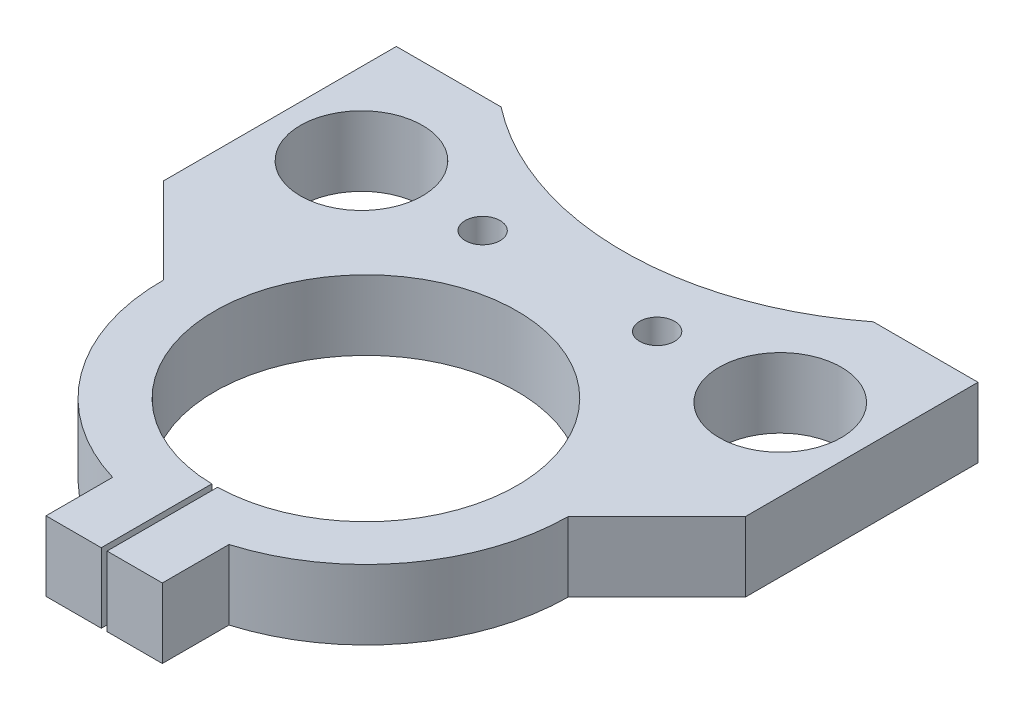
ISO-10303-21;
HEADER;
FILE_DESCRIPTION(('STEP AP214'),'2;1');
FILE_NAME('part.step','',(''),(''),'','','');
FILE_SCHEMA(('AUTOMOTIVE_DESIGN { 1 0 10303 214 1 1 1 1 }'));
ENDSEC;
DATA;
#1=APPLICATION_CONTEXT('core data for automotive mechanical design processes');
#2=APPLICATION_PROTOCOL_DEFINITION('international standard','automotive_design',2000,#1);
#3=PRODUCT_CONTEXT('',#1,'mechanical');
#4=PRODUCT('Part','Part','',(#3));
#5=PRODUCT_RELATED_PRODUCT_CATEGORY('part','',(#4));
#6=PRODUCT_DEFINITION_FORMATION('','',#4);
#7=PRODUCT_DEFINITION_CONTEXT('part definition',#1,'design');
#8=PRODUCT_DEFINITION('design','',#6,#7);
#9=PRODUCT_DEFINITION_SHAPE('','',#8);
#10=(LENGTH_UNIT() NAMED_UNIT(*) SI_UNIT(.MILLI.,.METRE.));
#11=(NAMED_UNIT(*) PLANE_ANGLE_UNIT() SI_UNIT($,.RADIAN.));
#12=(NAMED_UNIT(*) SI_UNIT($,.STERADIAN.) SOLID_ANGLE_UNIT());
#13=UNCERTAINTY_MEASURE_WITH_UNIT(LENGTH_MEASURE(1.E-05),#10,'distance_accuracy_value','');
#14=(GEOMETRIC_REPRESENTATION_CONTEXT(3) GLOBAL_UNCERTAINTY_ASSIGNED_CONTEXT((#13)) GLOBAL_UNIT_ASSIGNED_CONTEXT((#10,
#11,#12)) REPRESENTATION_CONTEXT('',''));
#15=CARTESIAN_POINT('',(0.,0.,0.));
#16=DIRECTION('',(0.,0.,1.));
#17=DIRECTION('',(1.,0.,0.));
#18=AXIS2_PLACEMENT_3D('',#15,#16,#17);
#19=CARTESIAN_POINT('',(50.,0.,100.));
#20=DIRECTION('',(0.,0.,1.));
#21=DIRECTION('',(1.,0.,0.));
#22=AXIS2_PLACEMENT_3D('',#19,#20,#21);
#23=PLANE('',#22);
#24=DIRECTION('',(0.,1.,0.));
#25=VECTOR('',#24,1.);
#26=CARTESIAN_POINT('',(0.265039177937347,-0.000999999999999265,100.));
#27=LINE('',#26,#25);
#28=CARTESIAN_POINT('',(0.265039177937347,0.,100.));
#29=VERTEX_POINT('',#28);
#30=CARTESIAN_POINT('',(0.265039177937347,12.,100.));
#31=VERTEX_POINT('',#30);
#32=EDGE_CURVE('E283',#29,#31,#27,.T.);
#33=ORIENTED_EDGE('',*,*,#32,.F.);
#34=DIRECTION('',(1.,0.,0.));
#35=VECTOR('',#34,1.);
#36=CARTESIAN_POINT('',(50.,0.,100.));
#37=LINE('',#36,#35);
#38=CARTESIAN_POINT('',(9.76503917793735,0.,100.));
#39=VERTEX_POINT('',#38);
#40=EDGE_CURVE('E208',#29,#39,#37,.T.);
#41=ORIENTED_EDGE('',*,*,#40,.T.);
#42=DIRECTION('',(0.,1.,0.));
#43=VECTOR('',#42,1.);
#44=CARTESIAN_POINT('',(9.76503917793735,-0.000999999999999265,100.));
#45=LINE('',#44,#43);
#46=CARTESIAN_POINT('',(9.76503917793735,12.,100.));
#47=VERTEX_POINT('',#46);
#48=EDGE_CURVE('E255',#39,#47,#45,.T.);
#49=ORIENTED_EDGE('',*,*,#48,.T.);
#50=DIRECTION('',(1.,0.,0.));
#51=VECTOR('',#50,1.);
#52=CARTESIAN_POINT('',(50.,12.,100.));
#53=LINE('',#52,#51);
#54=EDGE_CURVE('E203',#31,#47,#53,.T.);
#55=ORIENTED_EDGE('',*,*,#54,.F.);
#56=EDGE_LOOP('',(#33,#41,#49,#55));
#57=FACE_BOUND('',#56,.T.);
#58=ADVANCED_FACE('F32',(#57),#23,.T.);
#59=CARTESIAN_POINT('',(50.,12.,50.));
#60=DIRECTION('',(0.,1.,0.));
#61=DIRECTION('',(0.,0.,1.));
#62=AXIS2_PLACEMENT_3D('',#59,#60,#61);
#63=PLANE('',#62);
#64=CARTESIAN_POINT('',(14.8374657319728,12.,20.));
#65=DIRECTION('',(0.,1.,0.));
#66=DIRECTION('',(0.,0.,1.));
#67=AXIS2_PLACEMENT_3D('',#64,#65,#66);
#68=CIRCLE('',#67,3.);
#69=CARTESIAN_POINT('',(14.8374657319728,12.,23.));
#70=VERTEX_POINT('',#69);
#71=EDGE_CURVE('E392',#70,#70,#68,.T.);
#72=ORIENTED_EDGE('',*,*,#71,.F.);
#73=EDGE_LOOP('',(#72));
#74=FACE_BOUND('',#73,.T.);
#75=CARTESIAN_POINT('',(-15.1625342680272,12.,20.));
#76=DIRECTION('',(0.,1.,0.));
#77=DIRECTION('',(0.,0.,1.));
#78=AXIS2_PLACEMENT_3D('',#75,#76,#77);
#79=CIRCLE('',#78,3.);
#80=CARTESIAN_POINT('',(-15.1625342680272,12.,23.));
#81=VERTEX_POINT('',#80);
#82=EDGE_CURVE('E397',#81,#81,#79,.T.);
#83=ORIENTED_EDGE('',*,*,#82,.F.);
#84=EDGE_LOOP('',(#83));
#85=FACE_BOUND('',#84,.T.);
#86=DIRECTION('',(1.,0.,0.));
#87=VECTOR('',#86,1.);
#88=CARTESIAN_POINT('',(32.,12.,0.));
#89=LINE('',#88,#87);
#90=CARTESIAN_POINT('',(32.,12.,0.));
#91=VERTEX_POINT('',#90);
#92=CARTESIAN_POINT('',(50.,12.,0.));
#93=VERTEX_POINT('',#92);
#94=EDGE_CURVE('E178',#91,#93,#89,.T.);
#95=ORIENTED_EDGE('',*,*,#94,.F.);
#96=CARTESIAN_POINT('',(0.,12.,-41.0454545454546));
#97=DIRECTION('',(0.,1.,0.));
#98=DIRECTION('',(0.,0.,1.));
#99=AXIS2_PLACEMENT_3D('',#96,#97,#98);
#100=CIRCLE('',#99,52.0454545454546);
#101=CARTESIAN_POINT('',(-32.,12.,0.));
#102=VERTEX_POINT('',#101);
#103=EDGE_CURVE('E159',#102,#91,#100,.T.);
#104=ORIENTED_EDGE('',*,*,#103,.F.);
#105=DIRECTION('',(1.,0.,0.));
#106=VECTOR('',#105,1.);
#107=CARTESIAN_POINT('',(-50.,12.,0.));
#108=LINE('',#107,#106);
#109=CARTESIAN_POINT('',(-50.,12.,0.));
#110=VERTEX_POINT('',#109);
#111=EDGE_CURVE('E174',#110,#102,#108,.T.);
#112=ORIENTED_EDGE('',*,*,#111,.F.);
#113=DIRECTION('',(0.,0.,1.));
#114=VECTOR('',#113,1.);
#115=CARTESIAN_POINT('',(-50.,12.,-50.));
#116=LINE('',#115,#114);
#117=CARTESIAN_POINT('',(-50.,12.,40.));
#118=VERTEX_POINT('',#117);
#119=EDGE_CURVE('E11',#110,#118,#116,.T.);
#120=ORIENTED_EDGE('',*,*,#119,.T.);
#121=DIRECTION('',(-0.707106781186556,0.,-0.707106781186539));
#122=VECTOR('',#121,1.);
#123=CARTESIAN_POINT('',(-50.,12.,40.));
#124=LINE('',#123,#122);
#125=CARTESIAN_POINT('',(-35.2341773982398,12.,54.7658226017598));
#126=VERTEX_POINT('',#125);
#127=EDGE_CURVE('E295',#126,#118,#124,.T.);
#128=ORIENTED_EDGE('',*,*,#127,.F.);
#129=CARTESIAN_POINT('',(-0.234960822062653,12.,55.));
#130=DIRECTION('',(0.,-1.,0.));
#131=DIRECTION('',(0.,0.,1.));
#132=AXIS2_PLACEMENT_3D('',#129,#130,#131);
#133=CIRCLE('',#132,35.);
#134=CARTESIAN_POINT('',(-10.2349608220627,12.,88.5410196624969));
#135=VERTEX_POINT('',#134);
#136=EDGE_CURVE('E292',#135,#126,#133,.T.);
#137=ORIENTED_EDGE('',*,*,#136,.F.);
#138=DIRECTION('',(0.,0.,-1.));
#139=VECTOR('',#138,1.);
#140=CARTESIAN_POINT('',(-10.2349608220627,12.,88.5410196624969));
#141=LINE('',#140,#139);
#142=CARTESIAN_POINT('',(-10.2349608220627,12.,100.));
#143=VERTEX_POINT('',#142);
#144=EDGE_CURVE('E297',#143,#135,#141,.T.);
#145=ORIENTED_EDGE('',*,*,#144,.F.);
#146=CARTESIAN_POINT('',(-0.734960822062653,12.,100.));
#147=VERTEX_POINT('',#146);
#148=EDGE_CURVE('E209',#143,#147,#53,.T.);
#149=ORIENTED_EDGE('',*,*,#148,.T.);
#150=DIRECTION('',(0.,0.,1.));
#151=VECTOR('',#150,1.);
#152=CARTESIAN_POINT('',(-0.734960822062653,12.,80.9951918631119));
#153=LINE('',#152,#151);
#154=CARTESIAN_POINT('',(-0.734960822062653,12.,80.9951918631119));
#155=VERTEX_POINT('',#154);
#156=EDGE_CURVE('E274',#155,#147,#153,.T.);
#157=ORIENTED_EDGE('',*,*,#156,.F.);
#158=CARTESIAN_POINT('',(-0.234960822062653,12.,55.));
#159=DIRECTION('',(0.,1.,0.));
#160=DIRECTION('',(0.,0.,1.));
#161=AXIS2_PLACEMENT_3D('',#158,#159,#160);
#162=CIRCLE('',#161,26.);
#163=CARTESIAN_POINT('',(0.265039177937346,12.,80.9951918631119));
#164=VERTEX_POINT('',#163);
#165=EDGE_CURVE('E181',#164,#155,#162,.T.);
#166=ORIENTED_EDGE('',*,*,#165,.F.);
#167=DIRECTION('',(0.,0.,-1.));
#168=VECTOR('',#167,1.);
#169=CARTESIAN_POINT('',(0.265039177937347,12.,80.9951918631119));
#170=LINE('',#169,#168);
#171=EDGE_CURVE('E57',#31,#164,#170,.T.);
#172=ORIENTED_EDGE('',*,*,#171,.F.);
#173=ORIENTED_EDGE('',*,*,#54,.T.);
#174=DIRECTION('',(0.,0.,1.));
#175=VECTOR('',#174,1.);
#176=CARTESIAN_POINT('',(9.76503917793735,12.,88.5410196624969));
#177=LINE('',#176,#175);
#178=CARTESIAN_POINT('',(9.76503917793735,12.,88.5410196624969));
#179=VERTEX_POINT('',#178);
#180=EDGE_CURVE('E251',#179,#47,#177,.T.);
#181=ORIENTED_EDGE('',*,*,#180,.F.);
#182=CARTESIAN_POINT('',(-0.234960822062653,12.,55.));
#183=DIRECTION('',(0.,-1.,0.));
#184=DIRECTION('',(0.,0.,1.));
#185=AXIS2_PLACEMENT_3D('',#182,#183,#184);
#186=CIRCLE('',#185,35.);
#187=CARTESIAN_POINT('',(34.7642451640354,12.,55.2357548359648));
#188=VERTEX_POINT('',#187);
#189=EDGE_CURVE('E248',#188,#179,#186,.T.);
#190=ORIENTED_EDGE('',*,*,#189,.F.);
#191=DIRECTION('',(-0.707106781186544,0.,0.707106781186551));
#192=VECTOR('',#191,1.);
#193=CARTESIAN_POINT('',(50.,12.,40.));
#194=LINE('',#193,#192);
#195=CARTESIAN_POINT('',(50.,12.,40.));
#196=VERTEX_POINT('',#195);
#197=EDGE_CURVE('E245',#196,#188,#194,.T.);
#198=ORIENTED_EDGE('',*,*,#197,.F.);
#199=DIRECTION('',(0.,0.,-1.));
#200=VECTOR('',#199,1.);
#201=CARTESIAN_POINT('',(50.,12.,-50.));
#202=LINE('',#201,#200);
#203=EDGE_CURVE('E41',#196,#93,#202,.T.);
#204=ORIENTED_EDGE('',*,*,#203,.T.);
#205=EDGE_LOOP('',(#95,#104,#112,#120,#128,#137,#145,#149,#157,#166,#172,#173,#181,#190,#198,#204));
#206=FACE_BOUND('',#205,.T.);
#207=CARTESIAN_POINT('',(36.,12.,20.));
#208=DIRECTION('',(0.,1.,0.));
#209=DIRECTION('',(0.,0.,1.));
#210=AXIS2_PLACEMENT_3D('',#207,#208,#209);
#211=CIRCLE('',#210,10.5);
#212=CARTESIAN_POINT('',(36.,12.,30.5));
#213=VERTEX_POINT('',#212);
#214=EDGE_CURVE('E191',#213,#213,#211,.T.);
#215=ORIENTED_EDGE('',*,*,#214,.F.);
#216=EDGE_LOOP('',(#215));
#217=FACE_BOUND('',#216,.T.);
#218=CARTESIAN_POINT('',(-36.,12.,20.));
#219=DIRECTION('',(0.,1.,0.));
#220=DIRECTION('',(0.,0.,1.));
#221=AXIS2_PLACEMENT_3D('',#218,#219,#220);
#222=CIRCLE('',#221,10.5);
#223=CARTESIAN_POINT('',(-36.,12.,30.5));
#224=VERTEX_POINT('',#223);
#225=EDGE_CURVE('E197',#224,#224,#222,.T.);
#226=ORIENTED_EDGE('',*,*,#225,.F.);
#227=EDGE_LOOP('',(#226));
#228=FACE_BOUND('',#227,.T.);
#229=ADVANCED_FACE('F271',(#74,#85,#206,#217,#228),#63,.T.);
#230=CARTESIAN_POINT('',(50.,0.,50.));
#231=DIRECTION('',(0.,1.,0.));
#232=DIRECTION('',(0.,0.,1.));
#233=AXIS2_PLACEMENT_3D('',#230,#231,#232);
#234=PLANE('',#233);
#235=CARTESIAN_POINT('',(14.8374657319728,0.,20.));
#236=DIRECTION('',(0.,1.,0.));
#237=DIRECTION('',(0.,0.,1.));
#238=AXIS2_PLACEMENT_3D('',#235,#236,#237);
#239=CIRCLE('',#238,3.);
#240=CARTESIAN_POINT('',(14.8374657319728,0.,23.));
#241=VERTEX_POINT('',#240);
#242=EDGE_CURVE('E395',#241,#241,#239,.F.);
#243=ORIENTED_EDGE('',*,*,#242,.F.);
#244=EDGE_LOOP('',(#243));
#245=FACE_BOUND('',#244,.T.);
#246=CARTESIAN_POINT('',(-15.1625342680272,0.,20.));
#247=DIRECTION('',(0.,1.,0.));
#248=DIRECTION('',(0.,0.,1.));
#249=AXIS2_PLACEMENT_3D('',#246,#247,#248);
#250=CIRCLE('',#249,3.);
#251=CARTESIAN_POINT('',(-15.1625342680272,0.,23.));
#252=VERTEX_POINT('',#251);
#253=EDGE_CURVE('E400',#252,#252,#250,.F.);
#254=ORIENTED_EDGE('',*,*,#253,.F.);
#255=EDGE_LOOP('',(#254));
#256=FACE_BOUND('',#255,.T.);
#257=CARTESIAN_POINT('',(0.,0.,-41.0454545454546));
#258=DIRECTION('',(0.,1.,0.));
#259=DIRECTION('',(0.,0.,1.));
#260=AXIS2_PLACEMENT_3D('',#257,#258,#259);
#261=CIRCLE('',#260,52.0454545454546);
#262=CARTESIAN_POINT('',(-32.,0.,0.));
#263=VERTEX_POINT('',#262);
#264=CARTESIAN_POINT('',(32.,0.,0.));
#265=VERTEX_POINT('',#264);
#266=EDGE_CURVE('E147',#263,#265,#261,.T.);
#267=ORIENTED_EDGE('',*,*,#266,.T.);
#268=DIRECTION('',(-1.,0.,0.));
#269=VECTOR('',#268,1.);
#270=CARTESIAN_POINT('',(32.,0.,0.));
#271=LINE('',#270,#269);
#272=CARTESIAN_POINT('',(50.,0.,0.));
#273=VERTEX_POINT('',#272);
#274=EDGE_CURVE('E153',#273,#265,#271,.T.);
#275=ORIENTED_EDGE('',*,*,#274,.F.);
#276=DIRECTION('',(0.,0.,-1.));
#277=VECTOR('',#276,1.);
#278=CARTESIAN_POINT('',(50.,0.,-50.));
#279=LINE('',#278,#277);
#280=CARTESIAN_POINT('',(50.,0.,40.));
#281=VERTEX_POINT('',#280);
#282=EDGE_CURVE('E207',#281,#273,#279,.T.);
#283=ORIENTED_EDGE('',*,*,#282,.F.);
#284=DIRECTION('',(0.707106781186544,0.,-0.707106781186551));
#285=VECTOR('',#284,1.);
#286=CARTESIAN_POINT('',(50.,0.,40.));
#287=LINE('',#286,#285);
#288=CARTESIAN_POINT('',(34.7642451640354,0.,55.2357548359648));
#289=VERTEX_POINT('',#288);
#290=EDGE_CURVE('E229',#289,#281,#287,.T.);
#291=ORIENTED_EDGE('',*,*,#290,.F.);
#292=CARTESIAN_POINT('',(-0.234960822062653,0.,55.));
#293=DIRECTION('',(0.,1.,0.));
#294=DIRECTION('',(0.,0.,1.));
#295=AXIS2_PLACEMENT_3D('',#292,#293,#294);
#296=CIRCLE('',#295,35.);
#297=CARTESIAN_POINT('',(9.76503917793735,0.,88.5410196624969));
#298=VERTEX_POINT('',#297);
#299=EDGE_CURVE('E232',#298,#289,#296,.T.);
#300=ORIENTED_EDGE('',*,*,#299,.F.);
#301=DIRECTION('',(0.,0.,-1.));
#302=VECTOR('',#301,1.);
#303=CARTESIAN_POINT('',(9.76503917793735,0.,88.5410196624969));
#304=LINE('',#303,#302);
#305=EDGE_CURVE('E242',#39,#298,#304,.T.);
#306=ORIENTED_EDGE('',*,*,#305,.F.);
#307=ORIENTED_EDGE('',*,*,#40,.F.);
#308=DIRECTION('',(0.,0.,1.));
#309=VECTOR('',#308,1.);
#310=CARTESIAN_POINT('',(0.265039177937347,0.,80.9951918631119));
#311=LINE('',#310,#309);
#312=CARTESIAN_POINT('',(0.265039177937347,0.,80.9951918631119));
#313=VERTEX_POINT('',#312);
#314=EDGE_CURVE('E158',#313,#29,#311,.T.);
#315=ORIENTED_EDGE('',*,*,#314,.F.);
#316=CARTESIAN_POINT('',(-0.234960822062653,0.,55.));
#317=DIRECTION('',(0.,1.,0.));
#318=DIRECTION('',(0.,0.,1.));
#319=AXIS2_PLACEMENT_3D('',#316,#317,#318);
#320=CIRCLE('',#319,26.);
#321=CARTESIAN_POINT('',(-0.734960822062653,0.,80.9951918631119));
#322=VERTEX_POINT('',#321);
#323=EDGE_CURVE('E175',#322,#313,#320,.F.);
#324=ORIENTED_EDGE('',*,*,#323,.F.);
#325=DIRECTION('',(0.,0.,-1.));
#326=VECTOR('',#325,1.);
#327=CARTESIAN_POINT('',(-0.734960822062653,0.,80.9951918631119));
#328=LINE('',#327,#326);
#329=CARTESIAN_POINT('',(-0.734960822062653,0.,100.));
#330=VERTEX_POINT('',#329);
#331=EDGE_CURVE('E49',#330,#322,#328,.T.);
#332=ORIENTED_EDGE('',*,*,#331,.F.);
#333=CARTESIAN_POINT('',(-10.2349608220627,0.,100.));
#334=VERTEX_POINT('',#333);
#335=EDGE_CURVE('E204',#334,#330,#37,.T.);
#336=ORIENTED_EDGE('',*,*,#335,.F.);
#337=DIRECTION('',(0.,0.,1.));
#338=VECTOR('',#337,1.);
#339=CARTESIAN_POINT('',(-10.2349608220627,0.,88.5410196624969));
#340=LINE('',#339,#338);
#341=CARTESIAN_POINT('',(-10.2349608220627,0.,88.5410196624969));
#342=VERTEX_POINT('',#341);
#343=EDGE_CURVE('E290',#342,#334,#340,.T.);
#344=ORIENTED_EDGE('',*,*,#343,.F.);
#345=CARTESIAN_POINT('',(-0.234960822062653,0.,55.));
#346=DIRECTION('',(0.,1.,0.));
#347=DIRECTION('',(0.,0.,1.));
#348=AXIS2_PLACEMENT_3D('',#345,#346,#347);
#349=CIRCLE('',#348,35.);
#350=CARTESIAN_POINT('',(-35.2341773982398,0.,54.7658226017598));
#351=VERTEX_POINT('',#350);
#352=EDGE_CURVE('E227',#351,#342,#349,.T.);
#353=ORIENTED_EDGE('',*,*,#352,.F.);
#354=DIRECTION('',(0.707106781186556,0.,0.707106781186539));
#355=VECTOR('',#354,1.);
#356=CARTESIAN_POINT('',(-50.,0.,40.));
#357=LINE('',#356,#355);
#358=CARTESIAN_POINT('',(-50.,0.,40.));
#359=VERTEX_POINT('',#358);
#360=EDGE_CURVE('E224',#359,#351,#357,.T.);
#361=ORIENTED_EDGE('',*,*,#360,.F.);
#362=DIRECTION('',(0.,0.,1.));
#363=VECTOR('',#362,1.);
#364=CARTESIAN_POINT('',(-50.,0.,-50.));
#365=LINE('',#364,#363);
#366=CARTESIAN_POINT('',(-50.,0.,0.));
#367=VERTEX_POINT('',#366);
#368=EDGE_CURVE('E36',#367,#359,#365,.T.);
#369=ORIENTED_EDGE('',*,*,#368,.F.);
#370=DIRECTION('',(-1.,0.,0.));
#371=VECTOR('',#370,1.);
#372=CARTESIAN_POINT('',(-50.,0.,0.));
#373=LINE('',#372,#371);
#374=EDGE_CURVE('E155',#263,#367,#373,.T.);
#375=ORIENTED_EDGE('',*,*,#374,.F.);
#376=EDGE_LOOP('',(#267,#275,#283,#291,#300,#306,#307,#315,#324,#332,#336,#344,#353,#361,#369,#375));
#377=FACE_BOUND('',#376,.T.);
#378=CARTESIAN_POINT('',(36.,0.,20.));
#379=DIRECTION('',(0.,1.,0.));
#380=DIRECTION('',(0.,0.,1.));
#381=AXIS2_PLACEMENT_3D('',#378,#379,#380);
#382=CIRCLE('',#381,10.5);
#383=CARTESIAN_POINT('',(36.,0.,30.5));
#384=VERTEX_POINT('',#383);
#385=EDGE_CURVE('E194',#384,#384,#382,.F.);
#386=ORIENTED_EDGE('',*,*,#385,.F.);
#387=EDGE_LOOP('',(#386));
#388=FACE_BOUND('',#387,.T.);
#389=CARTESIAN_POINT('',(-36.,0.,20.));
#390=DIRECTION('',(0.,1.,0.));
#391=DIRECTION('',(0.,0.,1.));
#392=AXIS2_PLACEMENT_3D('',#389,#390,#391);
#393=CIRCLE('',#392,10.5);
#394=CARTESIAN_POINT('',(-36.,0.,30.5));
#395=VERTEX_POINT('',#394);
#396=EDGE_CURVE('E200',#395,#395,#393,.F.);
#397=ORIENTED_EDGE('',*,*,#396,.F.);
#398=EDGE_LOOP('',(#397));
#399=FACE_BOUND('',#398,.T.);
#400=ADVANCED_FACE('F149',(#245,#256,#377,#388,#399),#234,.F.);
#401=CARTESIAN_POINT('',(50.,12.,-50.));
#402=DIRECTION('',(-1.,0.,0.));
#403=DIRECTION('',(0.,0.,1.));
#404=AXIS2_PLACEMENT_3D('',#401,#402,#403);
#405=PLANE('',#404);
#406=ORIENTED_EDGE('',*,*,#203,.F.);
#407=DIRECTION('',(0.,1.,0.));
#408=VECTOR('',#407,1.);
#409=CARTESIAN_POINT('',(50.,-0.000999999999999265,40.));
#410=LINE('',#409,#408);
#411=EDGE_CURVE('E254',#281,#196,#410,.T.);
#412=ORIENTED_EDGE('',*,*,#411,.F.);
#413=ORIENTED_EDGE('',*,*,#282,.T.);
#414=DIRECTION('',(0.,1.,0.));
#415=VECTOR('',#414,1.);
#416=CARTESIAN_POINT('',(50.,-0.000999999999999265,0.));
#417=LINE('',#416,#415);
#418=EDGE_CURVE('E168',#273,#93,#417,.T.);
#419=ORIENTED_EDGE('',*,*,#418,.T.);
#420=EDGE_LOOP('',(#406,#412,#413,#419));
#421=FACE_BOUND('',#420,.T.);
#422=ADVANCED_FACE('F34',(#421),#405,.F.);
#423=CARTESIAN_POINT('',(-50.,12.,-50.));
#424=DIRECTION('',(1.,0.,0.));
#425=DIRECTION('',(0.,0.,-1.));
#426=AXIS2_PLACEMENT_3D('',#423,#424,#425);
#427=PLANE('',#426);
#428=ORIENTED_EDGE('',*,*,#368,.T.);
#429=DIRECTION('',(0.,1.,0.));
#430=VECTOR('',#429,1.);
#431=CARTESIAN_POINT('',(-50.,-0.000999999999999265,40.));
#432=LINE('',#431,#430);
#433=EDGE_CURVE('E220',#359,#118,#432,.T.);
#434=ORIENTED_EDGE('',*,*,#433,.T.);
#435=ORIENTED_EDGE('',*,*,#119,.F.);
#436=DIRECTION('',(0.,1.,0.));
#437=VECTOR('',#436,1.);
#438=CARTESIAN_POINT('',(-50.,-0.000999999999999265,0.));
#439=LINE('',#438,#437);
#440=EDGE_CURVE('E186',#367,#110,#439,.T.);
#441=ORIENTED_EDGE('',*,*,#440,.F.);
#442=EDGE_LOOP('',(#428,#434,#435,#441));
#443=FACE_BOUND('',#442,.T.);
#444=ADVANCED_FACE('F218',(#443),#427,.F.);
#445=DIRECTION('',(0.,1.,0.));
#446=VECTOR('',#445,1.);
#447=CARTESIAN_POINT('',(-0.734960822062653,-0.000999999999999265,100.));
#448=LINE('',#447,#446);
#449=EDGE_CURVE('E285',#330,#147,#448,.T.);
#450=ORIENTED_EDGE('',*,*,#449,.T.);
#451=ORIENTED_EDGE('',*,*,#148,.F.);
#452=DIRECTION('',(0.,1.,0.));
#453=VECTOR('',#452,1.);
#454=CARTESIAN_POINT('',(-10.2349608220627,-0.000999999999999265,100.));
#455=LINE('',#454,#453);
#456=EDGE_CURVE('E234',#334,#143,#455,.T.);
#457=ORIENTED_EDGE('',*,*,#456,.F.);
#458=ORIENTED_EDGE('',*,*,#335,.T.);
#459=EDGE_LOOP('',(#450,#451,#457,#458));
#460=FACE_BOUND('',#459,.T.);
#461=ADVANCED_FACE('F322',(#460),#23,.T.);
#462=CARTESIAN_POINT('',(-36.,-0.000999999999999265,20.));
#463=DIRECTION('',(0.,1.,0.));
#464=DIRECTION('',(0.,0.,1.));
#465=AXIS2_PLACEMENT_3D('',#462,#463,#464);
#466=CYLINDRICAL_SURFACE('',#465,10.5);
#467=ORIENTED_EDGE('',*,*,#225,.T.);
#468=EDGE_LOOP('',(#467));
#469=FACE_BOUND('',#468,.T.);
#470=ORIENTED_EDGE('',*,*,#396,.T.);
#471=EDGE_LOOP('',(#470));
#472=FACE_BOUND('',#471,.T.);
#473=ADVANCED_FACE('F331',(#469,#472),#466,.F.);
#474=CARTESIAN_POINT('',(36.,-0.000999999999999265,20.));
#475=DIRECTION('',(0.,1.,0.));
#476=DIRECTION('',(0.,0.,1.));
#477=AXIS2_PLACEMENT_3D('',#474,#475,#476);
#478=CYLINDRICAL_SURFACE('',#477,10.5);
#479=ORIENTED_EDGE('',*,*,#214,.T.);
#480=EDGE_LOOP('',(#479));
#481=FACE_BOUND('',#480,.T.);
#482=ORIENTED_EDGE('',*,*,#385,.T.);
#483=EDGE_LOOP('',(#482));
#484=FACE_BOUND('',#483,.T.);
#485=ADVANCED_FACE('F316',(#481,#484),#478,.F.);
#486=CARTESIAN_POINT('',(32.,-0.000999999999999265,0.));
#487=DIRECTION('',(0.,0.,1.));
#488=DIRECTION('',(1.,0.,0.));
#489=AXIS2_PLACEMENT_3D('',#486,#487,#488);
#490=PLANE('',#489);
#491=ORIENTED_EDGE('',*,*,#274,.T.);
#492=DIRECTION('',(0.,1.,0.));
#493=VECTOR('',#492,1.);
#494=CARTESIAN_POINT('',(32.,-0.000999999999999265,0.));
#495=LINE('',#494,#493);
#496=EDGE_CURVE('E162',#265,#91,#495,.T.);
#497=ORIENTED_EDGE('',*,*,#496,.T.);
#498=ORIENTED_EDGE('',*,*,#94,.T.);
#499=ORIENTED_EDGE('',*,*,#418,.F.);
#500=EDGE_LOOP('',(#491,#497,#498,#499));
#501=FACE_BOUND('',#500,.T.);
#502=ADVANCED_FACE('F172',(#501),#490,.F.);
#503=CARTESIAN_POINT('',(-50.,-0.000999999999999265,0.));
#504=DIRECTION('',(0.,0.,1.));
#505=DIRECTION('',(1.,0.,0.));
#506=AXIS2_PLACEMENT_3D('',#503,#504,#505);
#507=PLANE('',#506);
#508=ORIENTED_EDGE('',*,*,#374,.T.);
#509=ORIENTED_EDGE('',*,*,#440,.T.);
#510=ORIENTED_EDGE('',*,*,#111,.T.);
#511=DIRECTION('',(0.,1.,0.));
#512=VECTOR('',#511,1.);
#513=CARTESIAN_POINT('',(-32.,-0.000999999999999265,0.));
#514=LINE('',#513,#512);
#515=EDGE_CURVE('E169',#263,#102,#514,.T.);
#516=ORIENTED_EDGE('',*,*,#515,.F.);
#517=EDGE_LOOP('',(#508,#509,#510,#516));
#518=FACE_BOUND('',#517,.T.);
#519=ADVANCED_FACE('F307',(#518),#507,.F.);
#520=CARTESIAN_POINT('',(-0.234960822062653,-0.000999999999999265,55.));
#521=DIRECTION('',(0.,1.,0.));
#522=DIRECTION('',(0.,0.,1.));
#523=AXIS2_PLACEMENT_3D('',#520,#521,#522);
#524=CYLINDRICAL_SURFACE('',#523,26.);
#525=ORIENTED_EDGE('',*,*,#323,.T.);
#526=DIRECTION('',(0.,1.,0.));
#527=VECTOR('',#526,1.);
#528=CARTESIAN_POINT('',(0.265039177937347,-0.000999999999999265,80.9951918631119));
#529=LINE('',#528,#527);
#530=EDGE_CURVE('E268',#313,#164,#529,.T.);
#531=ORIENTED_EDGE('',*,*,#530,.T.);
#532=ORIENTED_EDGE('',*,*,#165,.T.);
#533=DIRECTION('',(0.,1.,0.));
#534=VECTOR('',#533,1.);
#535=CARTESIAN_POINT('',(-0.734960822062653,-0.000999999999999265,80.9951918631119));
#536=LINE('',#535,#534);
#537=EDGE_CURVE('E266',#322,#155,#536,.T.);
#538=ORIENTED_EDGE('',*,*,#537,.F.);
#539=EDGE_LOOP('',(#525,#531,#532,#538));
#540=FACE_BOUND('',#539,.T.);
#541=ADVANCED_FACE('F265',(#540),#524,.F.);
#542=CARTESIAN_POINT('',(9.76503917793735,-0.000999999999999265,88.5410196624969));
#543=DIRECTION('',(-1.,0.,0.));
#544=DIRECTION('',(0.,0.,1.));
#545=AXIS2_PLACEMENT_3D('',#542,#543,#544);
#546=PLANE('',#545);
#547=ORIENTED_EDGE('',*,*,#305,.T.);
#548=DIRECTION('',(0.,1.,0.));
#549=VECTOR('',#548,1.);
#550=CARTESIAN_POINT('',(9.76503917793735,-0.000999999999999265,88.5410196624969));
#551=LINE('',#550,#549);
#552=EDGE_CURVE('E258',#298,#179,#551,.T.);
#553=ORIENTED_EDGE('',*,*,#552,.T.);
#554=ORIENTED_EDGE('',*,*,#180,.T.);
#555=ORIENTED_EDGE('',*,*,#48,.F.);
#556=EDGE_LOOP('',(#547,#553,#554,#555));
#557=FACE_BOUND('',#556,.T.);
#558=ADVANCED_FACE('F314',(#557),#546,.F.);
#559=CARTESIAN_POINT('',(-0.234960822062653,-0.000999999999999265,55.));
#560=DIRECTION('',(0.,1.,0.));
#561=DIRECTION('',(0.,0.,1.));
#562=AXIS2_PLACEMENT_3D('',#559,#560,#561);
#563=CYLINDRICAL_SURFACE('',#562,35.);
#564=ORIENTED_EDGE('',*,*,#299,.T.);
#565=DIRECTION('',(0.,1.,0.));
#566=VECTOR('',#565,1.);
#567=CARTESIAN_POINT('',(34.7642451640354,-0.000999999999999265,55.2357548359648));
#568=LINE('',#567,#566);
#569=EDGE_CURVE('E260',#289,#188,#568,.T.);
#570=ORIENTED_EDGE('',*,*,#569,.T.);
#571=ORIENTED_EDGE('',*,*,#189,.T.);
#572=ORIENTED_EDGE('',*,*,#552,.F.);
#573=EDGE_LOOP('',(#564,#570,#571,#572));
#574=FACE_BOUND('',#573,.T.);
#575=ADVANCED_FACE('F351',(#574),#563,.T.);
#576=CARTESIAN_POINT('',(50.,-0.000999999999999265,40.));
#577=DIRECTION('',(-0.707106781186551,0.,-0.707106781186544));
#578=DIRECTION('',(-0.707106781186544,0.,0.707106781186551));
#579=AXIS2_PLACEMENT_3D('',#576,#577,#578);
#580=PLANE('',#579);
#581=ORIENTED_EDGE('',*,*,#290,.T.);
#582=ORIENTED_EDGE('',*,*,#411,.T.);
#583=ORIENTED_EDGE('',*,*,#197,.T.);
#584=ORIENTED_EDGE('',*,*,#569,.F.);
#585=EDGE_LOOP('',(#581,#582,#583,#584));
#586=FACE_BOUND('',#585,.T.);
#587=ADVANCED_FACE('F356',(#586),#580,.F.);
#588=CARTESIAN_POINT('',(-0.234960822062653,-0.000999999999999265,55.));
#589=DIRECTION('',(0.,1.,0.));
#590=DIRECTION('',(0.,0.,1.));
#591=AXIS2_PLACEMENT_3D('',#588,#589,#590);
#592=CYLINDRICAL_SURFACE('',#591,35.);
#593=ORIENTED_EDGE('',*,*,#352,.T.);
#594=DIRECTION('',(0.,1.,0.));
#595=VECTOR('',#594,1.);
#596=CARTESIAN_POINT('',(-10.2349608220627,-0.000999999999999265,88.5410196624969));
#597=LINE('',#596,#595);
#598=EDGE_CURVE('E230',#342,#135,#597,.T.);
#599=ORIENTED_EDGE('',*,*,#598,.T.);
#600=ORIENTED_EDGE('',*,*,#136,.T.);
#601=DIRECTION('',(0.,1.,0.));
#602=VECTOR('',#601,1.);
#603=CARTESIAN_POINT('',(-35.2341773982398,-0.000999999999999265,54.7658226017598));
#604=LINE('',#603,#602);
#605=EDGE_CURVE('E237',#351,#126,#604,.T.);
#606=ORIENTED_EDGE('',*,*,#605,.F.);
#607=EDGE_LOOP('',(#593,#599,#600,#606));
#608=FACE_BOUND('',#607,.T.);
#609=ADVANCED_FACE('F304',(#608),#592,.T.);
#610=CARTESIAN_POINT('',(-10.2349608220627,-0.000999999999999265,88.5410196624969));
#611=DIRECTION('',(1.,0.,0.));
#612=DIRECTION('',(0.,0.,-1.));
#613=AXIS2_PLACEMENT_3D('',#610,#611,#612);
#614=PLANE('',#613);
#615=ORIENTED_EDGE('',*,*,#343,.T.);
#616=ORIENTED_EDGE('',*,*,#456,.T.);
#617=ORIENTED_EDGE('',*,*,#144,.T.);
#618=ORIENTED_EDGE('',*,*,#598,.F.);
#619=EDGE_LOOP('',(#615,#616,#617,#618));
#620=FACE_BOUND('',#619,.T.);
#621=ADVANCED_FACE('F363',(#620),#614,.F.);
#622=CARTESIAN_POINT('',(-50.,-0.000999999999999265,40.));
#623=DIRECTION('',(0.707106781186539,0.,-0.707106781186556));
#624=DIRECTION('',(-0.707106781186556,0.,-0.707106781186539));
#625=AXIS2_PLACEMENT_3D('',#622,#623,#624);
#626=PLANE('',#625);
#627=ORIENTED_EDGE('',*,*,#360,.T.);
#628=ORIENTED_EDGE('',*,*,#605,.T.);
#629=ORIENTED_EDGE('',*,*,#127,.T.);
#630=ORIENTED_EDGE('',*,*,#433,.F.);
#631=EDGE_LOOP('',(#627,#628,#629,#630));
#632=FACE_BOUND('',#631,.T.);
#633=ADVANCED_FACE('F300',(#632),#626,.F.);
#634=CARTESIAN_POINT('',(-0.734960822062653,-0.000999999999999265,80.9951918631119));
#635=DIRECTION('',(-1.,0.,0.));
#636=DIRECTION('',(0.,0.,1.));
#637=AXIS2_PLACEMENT_3D('',#634,#635,#636);
#638=PLANE('',#637);
#639=ORIENTED_EDGE('',*,*,#331,.T.);
#640=ORIENTED_EDGE('',*,*,#537,.T.);
#641=ORIENTED_EDGE('',*,*,#156,.T.);
#642=ORIENTED_EDGE('',*,*,#449,.F.);
#643=EDGE_LOOP('',(#639,#640,#641,#642));
#644=FACE_BOUND('',#643,.T.);
#645=ADVANCED_FACE('F340',(#644),#638,.F.);
#646=CARTESIAN_POINT('',(0.265039177937347,-0.000999999999999265,80.9951918631119));
#647=DIRECTION('',(1.,0.,0.));
#648=DIRECTION('',(0.,0.,-1.));
#649=AXIS2_PLACEMENT_3D('',#646,#647,#648);
#650=PLANE('',#649);
#651=ORIENTED_EDGE('',*,*,#314,.T.);
#652=ORIENTED_EDGE('',*,*,#32,.T.);
#653=ORIENTED_EDGE('',*,*,#171,.T.);
#654=ORIENTED_EDGE('',*,*,#530,.F.);
#655=EDGE_LOOP('',(#651,#652,#653,#654));
#656=FACE_BOUND('',#655,.T.);
#657=ADVANCED_FACE('F344',(#656),#650,.F.);
#658=CARTESIAN_POINT('',(0.,-0.000999999999999265,-41.0454545454546));
#659=DIRECTION('',(0.,1.,0.));
#660=DIRECTION('',(0.,0.,1.));
#661=AXIS2_PLACEMENT_3D('',#658,#659,#660);
#662=CYLINDRICAL_SURFACE('',#661,52.0454545454546);
#663=ORIENTED_EDGE('',*,*,#266,.F.);
#664=ORIENTED_EDGE('',*,*,#515,.T.);
#665=ORIENTED_EDGE('',*,*,#103,.T.);
#666=ORIENTED_EDGE('',*,*,#496,.F.);
#667=EDGE_LOOP('',(#663,#664,#665,#666));
#668=FACE_BOUND('',#667,.T.);
#669=ADVANCED_FACE('F163',(#668),#662,.F.);
#670=CARTESIAN_POINT('',(-15.1625342680272,-0.000999999999999265,20.));
#671=DIRECTION('',(0.,1.,0.));
#672=DIRECTION('',(0.,0.,1.));
#673=AXIS2_PLACEMENT_3D('',#670,#671,#672);
#674=CYLINDRICAL_SURFACE('',#673,3.);
#675=ORIENTED_EDGE('',*,*,#82,.T.);
#676=EDGE_LOOP('',(#675));
#677=FACE_BOUND('',#676,.T.);
#678=ORIENTED_EDGE('',*,*,#253,.T.);
#679=EDGE_LOOP('',(#678));
#680=FACE_BOUND('',#679,.T.);
#681=ADVANCED_FACE('F380',(#677,#680),#674,.F.);
#682=CARTESIAN_POINT('',(14.8374657319728,-0.000999999999999265,20.));
#683=DIRECTION('',(0.,1.,0.));
#684=DIRECTION('',(0.,0.,1.));
#685=AXIS2_PLACEMENT_3D('',#682,#683,#684);
#686=CYLINDRICAL_SURFACE('',#685,3.);
#687=ORIENTED_EDGE('',*,*,#71,.T.);
#688=EDGE_LOOP('',(#687));
#689=FACE_BOUND('',#688,.T.);
#690=ORIENTED_EDGE('',*,*,#242,.T.);
#691=EDGE_LOOP('',(#690));
#692=FACE_BOUND('',#691,.T.);
#693=ADVANCED_FACE('F383',(#689,#692),#686,.F.);
#694=CLOSED_SHELL('',(#58,#229,#400,#422,#444,#461,#473,#485,#502,#519,#541,#558,#575,#587,#609,
#621,#633,#645,#657,#669,#681,#693));
#695=MANIFOLD_SOLID_BREP('B2',#694);
#696=ADVANCED_BREP_SHAPE_REPRESENTATION('',(#18,#695),#14);
#697=SHAPE_DEFINITION_REPRESENTATION(#9,#696);
ENDSEC;
END-ISO-10303-21;
